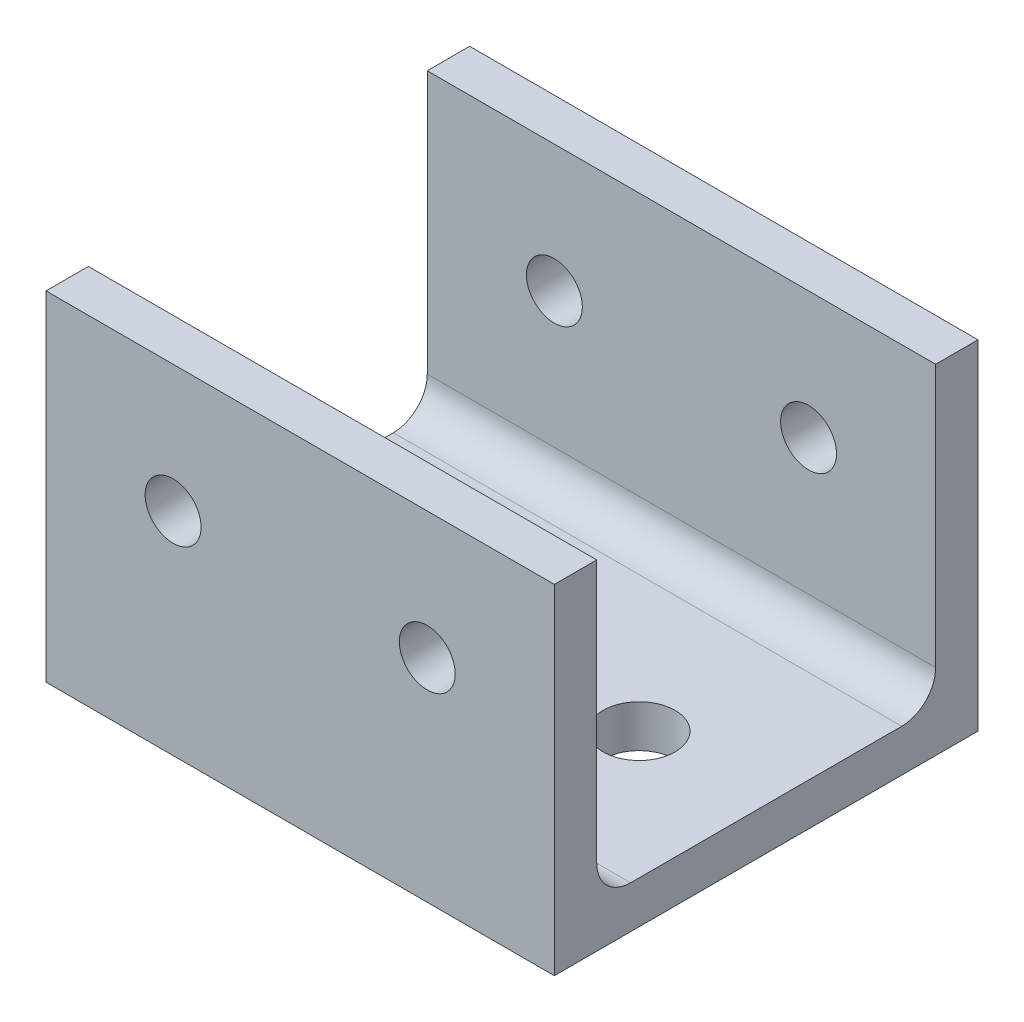
ISO-10303-21;
HEADER;
FILE_DESCRIPTION(('STEP AP214'),'2;1');
FILE_NAME('part.step','',(''),(''),'','','');
FILE_SCHEMA(('AUTOMOTIVE_DESIGN { 1 0 10303 214 1 1 1 1 }'));
ENDSEC;
DATA;
#1=APPLICATION_CONTEXT('core data for automotive mechanical design processes');
#2=APPLICATION_PROTOCOL_DEFINITION('international standard','automotive_design',2000,#1);
#3=PRODUCT_CONTEXT('',#1,'mechanical');
#4=PRODUCT('Part','Part','',(#3));
#5=PRODUCT_RELATED_PRODUCT_CATEGORY('part','',(#4));
#6=PRODUCT_DEFINITION_FORMATION('','',#4);
#7=PRODUCT_DEFINITION_CONTEXT('part definition',#1,'design');
#8=PRODUCT_DEFINITION('design','',#6,#7);
#9=PRODUCT_DEFINITION_SHAPE('','',#8);
#10=(LENGTH_UNIT() NAMED_UNIT(*) SI_UNIT(.MILLI.,.METRE.));
#11=(NAMED_UNIT(*) PLANE_ANGLE_UNIT() SI_UNIT($,.RADIAN.));
#12=(NAMED_UNIT(*) SI_UNIT($,.STERADIAN.) SOLID_ANGLE_UNIT());
#13=UNCERTAINTY_MEASURE_WITH_UNIT(LENGTH_MEASURE(1.E-05),#10,'distance_accuracy_value','');
#14=(GEOMETRIC_REPRESENTATION_CONTEXT(3) GLOBAL_UNCERTAINTY_ASSIGNED_CONTEXT((#13)) GLOBAL_UNIT_ASSIGNED_CONTEXT((#10,
#11,#12)) REPRESENTATION_CONTEXT('',''));
#15=CARTESIAN_POINT('',(0.,0.,0.));
#16=DIRECTION('',(0.,0.,1.));
#17=DIRECTION('',(1.,0.,0.));
#18=AXIS2_PLACEMENT_3D('',#15,#16,#17);
#19=CARTESIAN_POINT('',(60.,40.,0.));
#20=DIRECTION('',(0.,0.,-1.));
#21=DIRECTION('',(-1.,0.,0.));
#22=AXIS2_PLACEMENT_3D('',#19,#20,#21);
#23=PLANE('',#22);
#24=CARTESIAN_POINT('',(15.,25.,0.));
#25=DIRECTION('',(0.,0.,1.));
#26=DIRECTION('',(1.,0.,0.));
#27=AXIS2_PLACEMENT_3D('',#24,#25,#26);
#28=CIRCLE('',#27,3.3);
#29=CARTESIAN_POINT('',(18.3,25.,0.));
#30=VERTEX_POINT('',#29);
#31=EDGE_CURVE('E246',#30,#30,#28,.T.);
#32=ORIENTED_EDGE('',*,*,#31,.F.);
#33=EDGE_LOOP('',(#32));
#34=FACE_BOUND('',#33,.T.);
#35=CARTESIAN_POINT('',(45.,25.,0.));
#36=DIRECTION('',(0.,0.,1.));
#37=DIRECTION('',(1.,0.,0.));
#38=AXIS2_PLACEMENT_3D('',#35,#36,#37);
#39=CIRCLE('',#38,3.3);
#40=CARTESIAN_POINT('',(48.3,25.,0.));
#41=VERTEX_POINT('',#40);
#42=EDGE_CURVE('E240',#41,#41,#39,.T.);
#43=ORIENTED_EDGE('',*,*,#42,.F.);
#44=EDGE_LOOP('',(#43));
#45=FACE_BOUND('',#44,.T.);
#46=DIRECTION('',(0.,-1.,0.));
#47=VECTOR('',#46,1.);
#48=CARTESIAN_POINT('',(0.,40.,0.));
#49=LINE('',#48,#47);
#50=CARTESIAN_POINT('',(0.,40.,0.));
#51=VERTEX_POINT('',#50);
#52=CARTESIAN_POINT('',(0.,0.,0.));
#53=VERTEX_POINT('',#52);
#54=EDGE_CURVE('E137',#51,#53,#49,.T.);
#55=ORIENTED_EDGE('',*,*,#54,.T.);
#56=DIRECTION('',(-1.,0.,0.));
#57=VECTOR('',#56,1.);
#58=CARTESIAN_POINT('',(60.,0.,0.));
#59=LINE('',#58,#57);
#60=CARTESIAN_POINT('',(60.,0.,0.));
#61=VERTEX_POINT('',#60);
#62=EDGE_CURVE('E118',#61,#53,#59,.T.);
#63=ORIENTED_EDGE('',*,*,#62,.F.);
#64=DIRECTION('',(0.,-1.,0.));
#65=VECTOR('',#64,1.);
#66=CARTESIAN_POINT('',(60.,40.,0.));
#67=LINE('',#66,#65);
#68=CARTESIAN_POINT('',(60.,40.,0.));
#69=VERTEX_POINT('',#68);
#70=EDGE_CURVE('E125',#69,#61,#67,.T.);
#71=ORIENTED_EDGE('',*,*,#70,.F.);
#72=DIRECTION('',(-1.,0.,0.));
#73=VECTOR('',#72,1.);
#74=CARTESIAN_POINT('',(60.,40.,0.));
#75=LINE('',#74,#73);
#76=EDGE_CURVE('E204',#69,#51,#75,.T.);
#77=ORIENTED_EDGE('',*,*,#76,.T.);
#78=EDGE_LOOP('',(#55,#63,#71,#77));
#79=FACE_BOUND('',#78,.T.);
#80=ADVANCED_FACE('F37',(#34,#45,#79),#23,.F.);
#81=CARTESIAN_POINT('',(60.,0.,0.));
#82=DIRECTION('',(0.,1.,0.));
#83=DIRECTION('',(0.,0.,1.));
#84=AXIS2_PLACEMENT_3D('',#81,#82,#83);
#85=PLANE('',#84);
#86=CARTESIAN_POINT('',(15.,0.,-25.));
#87=DIRECTION('',(0.,1.,0.));
#88=DIRECTION('',(0.,0.,1.));
#89=AXIS2_PLACEMENT_3D('',#86,#87,#88);
#90=CIRCLE('',#89,4.25);
#91=CARTESIAN_POINT('',(15.,0.,-20.75));
#92=VERTEX_POINT('',#91);
#93=EDGE_CURVE('E151',#92,#92,#90,.T.);
#94=ORIENTED_EDGE('',*,*,#93,.T.);
#95=EDGE_LOOP('',(#94));
#96=FACE_BOUND('',#95,.T.);
#97=CARTESIAN_POINT('',(45.,0.,-25.));
#98=DIRECTION('',(0.,1.,0.));
#99=DIRECTION('',(0.,0.,1.));
#100=AXIS2_PLACEMENT_3D('',#97,#98,#99);
#101=CIRCLE('',#100,4.25);
#102=CARTESIAN_POINT('',(45.,0.,-20.75));
#103=VERTEX_POINT('',#102);
#104=EDGE_CURVE('E231',#103,#103,#101,.T.);
#105=ORIENTED_EDGE('',*,*,#104,.T.);
#106=EDGE_LOOP('',(#105));
#107=FACE_BOUND('',#106,.T.);
#108=DIRECTION('',(0.,0.,-1.));
#109=VECTOR('',#108,1.);
#110=CARTESIAN_POINT('',(0.,0.,0.));
#111=LINE('',#110,#109);
#112=CARTESIAN_POINT('',(0.,0.,-50.));
#113=VERTEX_POINT('',#112);
#114=EDGE_CURVE('E220',#53,#113,#111,.T.);
#115=ORIENTED_EDGE('',*,*,#114,.T.);
#116=DIRECTION('',(-1.,0.,0.));
#117=VECTOR('',#116,1.);
#118=CARTESIAN_POINT('',(60.,0.,-50.));
#119=LINE('',#118,#117);
#120=CARTESIAN_POINT('',(60.,0.,-50.));
#121=VERTEX_POINT('',#120);
#122=EDGE_CURVE('E121',#121,#113,#119,.T.);
#123=ORIENTED_EDGE('',*,*,#122,.F.);
#124=DIRECTION('',(0.,0.,-1.));
#125=VECTOR('',#124,1.);
#126=CARTESIAN_POINT('',(60.,0.,0.));
#127=LINE('',#126,#125);
#128=EDGE_CURVE('E114',#61,#121,#127,.T.);
#129=ORIENTED_EDGE('',*,*,#128,.F.);
#130=ORIENTED_EDGE('',*,*,#62,.T.);
#131=EDGE_LOOP('',(#115,#123,#129,#130));
#132=FACE_BOUND('',#131,.T.);
#133=ADVANCED_FACE('F116',(#96,#107,#132),#85,.F.);
#134=CARTESIAN_POINT('',(60.,0.,-50.));
#135=DIRECTION('',(0.,0.,1.));
#136=DIRECTION('',(1.,0.,0.));
#137=AXIS2_PLACEMENT_3D('',#134,#135,#136);
#138=PLANE('',#137);
#139=CARTESIAN_POINT('',(15.,25.,-50.));
#140=DIRECTION('',(0.,0.,1.));
#141=DIRECTION('',(1.,0.,0.));
#142=AXIS2_PLACEMENT_3D('',#139,#140,#141);
#143=CIRCLE('',#142,3.3);
#144=CARTESIAN_POINT('',(18.3,25.,-50.));
#145=VERTEX_POINT('',#144);
#146=EDGE_CURVE('E158',#145,#145,#143,.T.);
#147=ORIENTED_EDGE('',*,*,#146,.T.);
#148=EDGE_LOOP('',(#147));
#149=FACE_BOUND('',#148,.T.);
#150=CARTESIAN_POINT('',(45.,25.,-50.));
#151=DIRECTION('',(0.,0.,1.));
#152=DIRECTION('',(1.,0.,0.));
#153=AXIS2_PLACEMENT_3D('',#150,#151,#152);
#154=CIRCLE('',#153,3.3);
#155=CARTESIAN_POINT('',(48.3,25.,-50.));
#156=VERTEX_POINT('',#155);
#157=EDGE_CURVE('E243',#156,#156,#154,.T.);
#158=ORIENTED_EDGE('',*,*,#157,.T.);
#159=EDGE_LOOP('',(#158));
#160=FACE_BOUND('',#159,.T.);
#161=DIRECTION('',(0.,1.,0.));
#162=VECTOR('',#161,1.);
#163=CARTESIAN_POINT('',(0.,0.,-50.));
#164=LINE('',#163,#162);
#165=CARTESIAN_POINT('',(0.,40.,-50.));
#166=VERTEX_POINT('',#165);
#167=EDGE_CURVE('E219',#113,#166,#164,.T.);
#168=ORIENTED_EDGE('',*,*,#167,.T.);
#169=DIRECTION('',(-1.,0.,0.));
#170=VECTOR('',#169,1.);
#171=CARTESIAN_POINT('',(60.,40.,-50.));
#172=LINE('',#171,#170);
#173=CARTESIAN_POINT('',(60.,40.,-50.));
#174=VERTEX_POINT('',#173);
#175=EDGE_CURVE('E143',#174,#166,#172,.T.);
#176=ORIENTED_EDGE('',*,*,#175,.F.);
#177=DIRECTION('',(0.,1.,0.));
#178=VECTOR('',#177,1.);
#179=CARTESIAN_POINT('',(60.,0.,-50.));
#180=LINE('',#179,#178);
#181=EDGE_CURVE('E124',#121,#174,#180,.T.);
#182=ORIENTED_EDGE('',*,*,#181,.F.);
#183=ORIENTED_EDGE('',*,*,#122,.T.);
#184=EDGE_LOOP('',(#168,#176,#182,#183));
#185=FACE_BOUND('',#184,.T.);
#186=ADVANCED_FACE('F252',(#149,#160,#185),#138,.F.);
#187=CARTESIAN_POINT('',(60.,40.,-50.));
#188=DIRECTION('',(0.,-1.,0.));
#189=DIRECTION('',(0.,0.,-1.));
#190=AXIS2_PLACEMENT_3D('',#187,#188,#189);
#191=PLANE('',#190);
#192=DIRECTION('',(0.,0.,1.));
#193=VECTOR('',#192,1.);
#194=CARTESIAN_POINT('',(0.,40.,-50.));
#195=LINE('',#194,#193);
#196=CARTESIAN_POINT('',(0.,40.,-45.));
#197=VERTEX_POINT('',#196);
#198=EDGE_CURVE('E199',#166,#197,#195,.T.);
#199=ORIENTED_EDGE('',*,*,#198,.T.);
#200=DIRECTION('',(-1.,0.,0.));
#201=VECTOR('',#200,1.);
#202=CARTESIAN_POINT('',(60.,40.,-45.));
#203=LINE('',#202,#201);
#204=CARTESIAN_POINT('',(60.,40.,-45.));
#205=VERTEX_POINT('',#204);
#206=EDGE_CURVE('E207',#205,#197,#203,.T.);
#207=ORIENTED_EDGE('',*,*,#206,.F.);
#208=DIRECTION('',(0.,0.,1.));
#209=VECTOR('',#208,1.);
#210=CARTESIAN_POINT('',(60.,40.,-50.));
#211=LINE('',#210,#209);
#212=EDGE_CURVE('E216',#174,#205,#211,.T.);
#213=ORIENTED_EDGE('',*,*,#212,.F.);
#214=ORIENTED_EDGE('',*,*,#175,.T.);
#215=EDGE_LOOP('',(#199,#207,#213,#214));
#216=FACE_BOUND('',#215,.T.);
#217=ADVANCED_FACE('F214',(#216),#191,.F.);
#218=CARTESIAN_POINT('',(60.,40.,-45.));
#219=DIRECTION('',(0.,0.,-1.));
#220=DIRECTION('',(-1.,0.,0.));
#221=AXIS2_PLACEMENT_3D('',#218,#219,#220);
#222=PLANE('',#221);
#223=CARTESIAN_POINT('',(15.,25.,-45.));
#224=DIRECTION('',(0.,0.,-1.));
#225=DIRECTION('',(-1.,0.,0.));
#226=AXIS2_PLACEMENT_3D('',#223,#224,#225);
#227=CIRCLE('',#226,3.3);
#228=CARTESIAN_POINT('',(11.7,25.,-45.));
#229=VERTEX_POINT('',#228);
#230=EDGE_CURVE('E161',#229,#229,#227,.T.);
#231=ORIENTED_EDGE('',*,*,#230,.T.);
#232=EDGE_LOOP('',(#231));
#233=FACE_BOUND('',#232,.T.);
#234=CARTESIAN_POINT('',(45.,25.,-45.));
#235=DIRECTION('',(0.,0.,-1.));
#236=DIRECTION('',(-1.,0.,0.));
#237=AXIS2_PLACEMENT_3D('',#234,#235,#236);
#238=CIRCLE('',#237,3.3);
#239=CARTESIAN_POINT('',(41.7,25.,-45.));
#240=VERTEX_POINT('',#239);
#241=EDGE_CURVE('E157',#240,#240,#238,.T.);
#242=ORIENTED_EDGE('',*,*,#241,.T.);
#243=EDGE_LOOP('',(#242));
#244=FACE_BOUND('',#243,.T.);
#245=DIRECTION('',(0.,-1.,0.));
#246=VECTOR('',#245,1.);
#247=CARTESIAN_POINT('',(0.,40.,-45.));
#248=LINE('',#247,#246);
#249=CARTESIAN_POINT('',(0.,9.,-45.));
#250=VERTEX_POINT('',#249);
#251=EDGE_CURVE('E196',#197,#250,#248,.T.);
#252=ORIENTED_EDGE('',*,*,#251,.T.);
#253=DIRECTION('',(-1.,0.,0.));
#254=VECTOR('',#253,1.);
#255=CARTESIAN_POINT('',(60.,9.,-45.));
#256=LINE('',#255,#254);
#257=CARTESIAN_POINT('',(60.,9.,-45.));
#258=VERTEX_POINT('',#257);
#259=EDGE_CURVE('E52',#250,#258,#256,.F.);
#260=ORIENTED_EDGE('',*,*,#259,.T.);
#261=DIRECTION('',(0.,-1.,0.));
#262=VECTOR('',#261,1.);
#263=CARTESIAN_POINT('',(60.,40.,-45.));
#264=LINE('',#263,#262);
#265=EDGE_CURVE('E227',#205,#258,#264,.T.);
#266=ORIENTED_EDGE('',*,*,#265,.F.);
#267=ORIENTED_EDGE('',*,*,#206,.T.);
#268=EDGE_LOOP('',(#252,#260,#266,#267));
#269=FACE_BOUND('',#268,.T.);
#270=ADVANCED_FACE('F263',(#233,#244,#269),#222,.F.);
#271=CARTESIAN_POINT('',(60.,5.,-45.));
#272=DIRECTION('',(0.,-1.,0.));
#273=DIRECTION('',(0.,0.,-1.));
#274=AXIS2_PLACEMENT_3D('',#271,#272,#273);
#275=PLANE('',#274);
#276=CARTESIAN_POINT('',(15.,5.,-25.));
#277=DIRECTION('',(0.,-1.,0.));
#278=DIRECTION('',(0.,0.,-1.));
#279=AXIS2_PLACEMENT_3D('',#276,#277,#278);
#280=CIRCLE('',#279,4.25);
#281=CARTESIAN_POINT('',(15.,5.,-29.25));
#282=VERTEX_POINT('',#281);
#283=EDGE_CURVE('E150',#282,#282,#280,.F.);
#284=ORIENTED_EDGE('',*,*,#283,.F.);
#285=EDGE_LOOP('',(#284));
#286=FACE_BOUND('',#285,.T.);
#287=CARTESIAN_POINT('',(45.,5.,-25.));
#288=DIRECTION('',(0.,-1.,0.));
#289=DIRECTION('',(0.,0.,-1.));
#290=AXIS2_PLACEMENT_3D('',#287,#288,#289);
#291=CIRCLE('',#290,4.25);
#292=CARTESIAN_POINT('',(45.,5.,-29.25));
#293=VERTEX_POINT('',#292);
#294=EDGE_CURVE('E147',#293,#293,#291,.F.);
#295=ORIENTED_EDGE('',*,*,#294,.F.);
#296=EDGE_LOOP('',(#295));
#297=FACE_BOUND('',#296,.T.);
#298=DIRECTION('',(0.,0.,1.));
#299=VECTOR('',#298,1.);
#300=CARTESIAN_POINT('',(0.,5.,-45.));
#301=LINE('',#300,#299);
#302=CARTESIAN_POINT('',(0.,5.,-41.));
#303=VERTEX_POINT('',#302);
#304=CARTESIAN_POINT('',(0.,5.,-9.));
#305=VERTEX_POINT('',#304);
#306=EDGE_CURVE('E190',#303,#305,#301,.T.);
#307=ORIENTED_EDGE('',*,*,#306,.T.);
#308=DIRECTION('',(-1.,0.,0.));
#309=VECTOR('',#308,1.);
#310=CARTESIAN_POINT('',(60.,5.,-9.));
#311=LINE('',#310,#309);
#312=CARTESIAN_POINT('',(60.,5.,-9.));
#313=VERTEX_POINT('',#312);
#314=EDGE_CURVE('E165',#305,#313,#311,.F.);
#315=ORIENTED_EDGE('',*,*,#314,.T.);
#316=DIRECTION('',(0.,0.,1.));
#317=VECTOR('',#316,1.);
#318=CARTESIAN_POINT('',(60.,5.,-45.));
#319=LINE('',#318,#317);
#320=CARTESIAN_POINT('',(60.,5.,-41.));
#321=VERTEX_POINT('',#320);
#322=EDGE_CURVE('E177',#321,#313,#319,.T.);
#323=ORIENTED_EDGE('',*,*,#322,.F.);
#324=DIRECTION('',(-1.,0.,0.));
#325=VECTOR('',#324,1.);
#326=CARTESIAN_POINT('',(0.,5.,-41.));
#327=LINE('',#326,#325);
#328=EDGE_CURVE('E141',#321,#303,#327,.T.);
#329=ORIENTED_EDGE('',*,*,#328,.T.);
#330=EDGE_LOOP('',(#307,#315,#323,#329));
#331=FACE_BOUND('',#330,.T.);
#332=ADVANCED_FACE('F194',(#286,#297,#331),#275,.F.);
#333=CARTESIAN_POINT('',(60.,5.,-5.));
#334=DIRECTION('',(0.,0.,1.));
#335=DIRECTION('',(1.,0.,0.));
#336=AXIS2_PLACEMENT_3D('',#333,#334,#335);
#337=PLANE('',#336);
#338=CARTESIAN_POINT('',(15.,25.,-5.));
#339=DIRECTION('',(0.,0.,1.));
#340=DIRECTION('',(1.,0.,0.));
#341=AXIS2_PLACEMENT_3D('',#338,#339,#340);
#342=CIRCLE('',#341,3.3);
#343=CARTESIAN_POINT('',(18.3,25.,-5.));
#344=VERTEX_POINT('',#343);
#345=EDGE_CURVE('E159',#344,#344,#342,.T.);
#346=ORIENTED_EDGE('',*,*,#345,.T.);
#347=EDGE_LOOP('',(#346));
#348=FACE_BOUND('',#347,.T.);
#349=CARTESIAN_POINT('',(45.,25.,-5.));
#350=DIRECTION('',(0.,0.,1.));
#351=DIRECTION('',(1.,0.,0.));
#352=AXIS2_PLACEMENT_3D('',#349,#350,#351);
#353=CIRCLE('',#352,3.3);
#354=CARTESIAN_POINT('',(48.3,25.,-5.));
#355=VERTEX_POINT('',#354);
#356=EDGE_CURVE('E154',#355,#355,#353,.T.);
#357=ORIENTED_EDGE('',*,*,#356,.T.);
#358=EDGE_LOOP('',(#357));
#359=FACE_BOUND('',#358,.T.);
#360=DIRECTION('',(0.,1.,0.));
#361=VECTOR('',#360,1.);
#362=CARTESIAN_POINT('',(60.,5.,-5.));
#363=LINE('',#362,#361);
#364=CARTESIAN_POINT('',(60.,9.,-5.));
#365=VERTEX_POINT('',#364);
#366=CARTESIAN_POINT('',(60.,40.,-5.));
#367=VERTEX_POINT('',#366);
#368=EDGE_CURVE('E174',#365,#367,#363,.T.);
#369=ORIENTED_EDGE('',*,*,#368,.F.);
#370=DIRECTION('',(-1.,0.,0.));
#371=VECTOR('',#370,1.);
#372=CARTESIAN_POINT('',(0.,9.,-5.));
#373=LINE('',#372,#371);
#374=CARTESIAN_POINT('',(0.,9.,-5.));
#375=VERTEX_POINT('',#374);
#376=EDGE_CURVE('E138',#365,#375,#373,.T.);
#377=ORIENTED_EDGE('',*,*,#376,.T.);
#378=DIRECTION('',(0.,1.,0.));
#379=VECTOR('',#378,1.);
#380=CARTESIAN_POINT('',(0.,5.,-5.));
#381=LINE('',#380,#379);
#382=CARTESIAN_POINT('',(0.,40.,-5.));
#383=VERTEX_POINT('',#382);
#384=EDGE_CURVE('E192',#375,#383,#381,.T.);
#385=ORIENTED_EDGE('',*,*,#384,.T.);
#386=DIRECTION('',(-1.,0.,0.));
#387=VECTOR('',#386,1.);
#388=CARTESIAN_POINT('',(60.,40.,-5.));
#389=LINE('',#388,#387);
#390=EDGE_CURVE('E185',#367,#383,#389,.T.);
#391=ORIENTED_EDGE('',*,*,#390,.F.);
#392=EDGE_LOOP('',(#369,#377,#385,#391));
#393=FACE_BOUND('',#392,.T.);
#394=ADVANCED_FACE('F182',(#348,#359,#393),#337,.F.);
#395=CARTESIAN_POINT('',(60.,40.,-5.));
#396=DIRECTION('',(0.,-1.,0.));
#397=DIRECTION('',(0.,0.,-1.));
#398=AXIS2_PLACEMENT_3D('',#395,#396,#397);
#399=PLANE('',#398);
#400=DIRECTION('',(0.,0.,1.));
#401=VECTOR('',#400,1.);
#402=CARTESIAN_POINT('',(0.,40.,-5.));
#403=LINE('',#402,#401);
#404=EDGE_CURVE('E134',#383,#51,#403,.T.);
#405=ORIENTED_EDGE('',*,*,#404,.T.);
#406=ORIENTED_EDGE('',*,*,#76,.F.);
#407=DIRECTION('',(0.,0.,1.));
#408=VECTOR('',#407,1.);
#409=CARTESIAN_POINT('',(60.,40.,-5.));
#410=LINE('',#409,#408);
#411=EDGE_CURVE('E130',#367,#69,#410,.T.);
#412=ORIENTED_EDGE('',*,*,#411,.F.);
#413=ORIENTED_EDGE('',*,*,#390,.T.);
#414=EDGE_LOOP('',(#405,#406,#412,#413));
#415=FACE_BOUND('',#414,.T.);
#416=ADVANCED_FACE('F317',(#415),#399,.F.);
#417=CARTESIAN_POINT('',(60.,0.,0.));
#418=DIRECTION('',(1.,0.,0.));
#419=DIRECTION('',(0.,0.,-1.));
#420=AXIS2_PLACEMENT_3D('',#417,#418,#419);
#421=PLANE('',#420);
#422=ORIENTED_EDGE('',*,*,#70,.T.);
#423=ORIENTED_EDGE('',*,*,#128,.T.);
#424=ORIENTED_EDGE('',*,*,#181,.T.);
#425=ORIENTED_EDGE('',*,*,#212,.T.);
#426=ORIENTED_EDGE('',*,*,#265,.T.);
#427=CARTESIAN_POINT('',(60.,9.,-41.));
#428=DIRECTION('',(1.,0.,0.));
#429=DIRECTION('',(0.,0.,-1.));
#430=AXIS2_PLACEMENT_3D('',#427,#428,#429);
#431=CIRCLE('',#430,4.);
#432=EDGE_CURVE('E11',#258,#321,#431,.F.);
#433=ORIENTED_EDGE('',*,*,#432,.T.);
#434=ORIENTED_EDGE('',*,*,#322,.T.);
#435=CARTESIAN_POINT('',(60.,9.,-9.));
#436=DIRECTION('',(1.,0.,0.));
#437=DIRECTION('',(0.,0.,-1.));
#438=AXIS2_PLACEMENT_3D('',#435,#436,#437);
#439=CIRCLE('',#438,4.);
#440=EDGE_CURVE('E170',#313,#365,#439,.F.);
#441=ORIENTED_EDGE('',*,*,#440,.T.);
#442=ORIENTED_EDGE('',*,*,#368,.T.);
#443=ORIENTED_EDGE('',*,*,#411,.T.);
#444=EDGE_LOOP('',(#422,#423,#424,#425,#426,#433,#434,#441,#442,#443));
#445=FACE_BOUND('',#444,.T.);
#446=ADVANCED_FACE('F128',(#445),#421,.T.);
#447=CARTESIAN_POINT('',(0.,0.,0.));
#448=DIRECTION('',(1.,0.,0.));
#449=DIRECTION('',(0.,0.,-1.));
#450=AXIS2_PLACEMENT_3D('',#447,#448,#449);
#451=PLANE('',#450);
#452=ORIENTED_EDGE('',*,*,#54,.F.);
#453=ORIENTED_EDGE('',*,*,#404,.F.);
#454=ORIENTED_EDGE('',*,*,#384,.F.);
#455=CARTESIAN_POINT('',(0.,9.,-9.));
#456=DIRECTION('',(1.,0.,0.));
#457=DIRECTION('',(0.,0.,-1.));
#458=AXIS2_PLACEMENT_3D('',#455,#456,#457);
#459=CIRCLE('',#458,4.);
#460=EDGE_CURVE('E168',#375,#305,#459,.T.);
#461=ORIENTED_EDGE('',*,*,#460,.T.);
#462=ORIENTED_EDGE('',*,*,#306,.F.);
#463=CARTESIAN_POINT('',(0.,9.,-41.));
#464=DIRECTION('',(1.,0.,0.));
#465=DIRECTION('',(0.,0.,-1.));
#466=AXIS2_PLACEMENT_3D('',#463,#464,#465);
#467=CIRCLE('',#466,4.);
#468=EDGE_CURVE('E45',#303,#250,#467,.T.);
#469=ORIENTED_EDGE('',*,*,#468,.T.);
#470=ORIENTED_EDGE('',*,*,#251,.F.);
#471=ORIENTED_EDGE('',*,*,#198,.F.);
#472=ORIENTED_EDGE('',*,*,#167,.F.);
#473=ORIENTED_EDGE('',*,*,#114,.F.);
#474=EDGE_LOOP('',(#452,#453,#454,#461,#462,#469,#470,#471,#472,#473));
#475=FACE_BOUND('',#474,.T.);
#476=ADVANCED_FACE('F189',(#475),#451,.F.);
#477=CARTESIAN_POINT('',(45.,40.,-25.));
#478=DIRECTION('',(0.,-1.,0.));
#479=DIRECTION('',(0.,0.,-1.));
#480=AXIS2_PLACEMENT_3D('',#477,#478,#479);
#481=CYLINDRICAL_SURFACE('',#480,4.25);
#482=ORIENTED_EDGE('',*,*,#104,.F.);
#483=EDGE_LOOP('',(#482));
#484=FACE_BOUND('',#483,.T.);
#485=ORIENTED_EDGE('',*,*,#294,.T.);
#486=EDGE_LOOP('',(#485));
#487=FACE_BOUND('',#486,.T.);
#488=ADVANCED_FACE('F306',(#484,#487),#481,.F.);
#489=CARTESIAN_POINT('',(15.,40.,-25.));
#490=DIRECTION('',(0.,-1.,0.));
#491=DIRECTION('',(0.,0.,-1.));
#492=AXIS2_PLACEMENT_3D('',#489,#490,#491);
#493=CYLINDRICAL_SURFACE('',#492,4.25);
#494=ORIENTED_EDGE('',*,*,#93,.F.);
#495=EDGE_LOOP('',(#494));
#496=FACE_BOUND('',#495,.T.);
#497=ORIENTED_EDGE('',*,*,#283,.T.);
#498=EDGE_LOOP('',(#497));
#499=FACE_BOUND('',#498,.T.);
#500=ADVANCED_FACE('F375',(#496,#499),#493,.F.);
#501=CARTESIAN_POINT('',(45.,25.,-50.));
#502=DIRECTION('',(0.,0.,1.));
#503=DIRECTION('',(1.,0.,0.));
#504=AXIS2_PLACEMENT_3D('',#501,#502,#503);
#505=CYLINDRICAL_SURFACE('',#504,3.3);
#506=ORIENTED_EDGE('',*,*,#42,.T.);
#507=EDGE_LOOP('',(#506));
#508=FACE_BOUND('',#507,.T.);
#509=ORIENTED_EDGE('',*,*,#356,.F.);
#510=EDGE_LOOP('',(#509));
#511=FACE_BOUND('',#510,.T.);
#512=ADVANCED_FACE('F360',(#508,#511),#505,.F.);
#513=CARTESIAN_POINT('',(15.,25.,-50.));
#514=DIRECTION('',(0.,0.,1.));
#515=DIRECTION('',(1.,0.,0.));
#516=AXIS2_PLACEMENT_3D('',#513,#514,#515);
#517=CYLINDRICAL_SURFACE('',#516,3.3);
#518=ORIENTED_EDGE('',*,*,#31,.T.);
#519=EDGE_LOOP('',(#518));
#520=FACE_BOUND('',#519,.T.);
#521=ORIENTED_EDGE('',*,*,#345,.F.);
#522=EDGE_LOOP('',(#521));
#523=FACE_BOUND('',#522,.T.);
#524=ADVANCED_FACE('F260',(#520,#523),#517,.F.);
#525=ORIENTED_EDGE('',*,*,#157,.F.);
#526=EDGE_LOOP('',(#525));
#527=FACE_BOUND('',#526,.T.);
#528=ORIENTED_EDGE('',*,*,#241,.F.);
#529=EDGE_LOOP('',(#528));
#530=FACE_BOUND('',#529,.T.);
#531=ADVANCED_FACE('F258',(#527,#530),#505,.F.);
#532=ORIENTED_EDGE('',*,*,#146,.F.);
#533=EDGE_LOOP('',(#532));
#534=FACE_BOUND('',#533,.T.);
#535=ORIENTED_EDGE('',*,*,#230,.F.);
#536=EDGE_LOOP('',(#535));
#537=FACE_BOUND('',#536,.T.);
#538=ADVANCED_FACE('F255',(#534,#537),#517,.F.);
#539=CARTESIAN_POINT('',(60.,9.,-9.));
#540=DIRECTION('',(1.,0.,0.));
#541=DIRECTION('',(0.,0.,-1.));
#542=AXIS2_PLACEMENT_3D('',#539,#540,#541);
#543=CYLINDRICAL_SURFACE('',#542,4.);
#544=ORIENTED_EDGE('',*,*,#440,.F.);
#545=ORIENTED_EDGE('',*,*,#314,.F.);
#546=ORIENTED_EDGE('',*,*,#460,.F.);
#547=ORIENTED_EDGE('',*,*,#376,.F.);
#548=EDGE_LOOP('',(#544,#545,#546,#547));
#549=FACE_BOUND('',#548,.T.);
#550=ADVANCED_FACE('F187',(#549),#543,.F.);
#551=CARTESIAN_POINT('',(60.,9.,-41.));
#552=DIRECTION('',(1.,0.,0.));
#553=DIRECTION('',(0.,0.,-1.));
#554=AXIS2_PLACEMENT_3D('',#551,#552,#553);
#555=CYLINDRICAL_SURFACE('',#554,4.);
#556=ORIENTED_EDGE('',*,*,#432,.F.);
#557=ORIENTED_EDGE('',*,*,#259,.F.);
#558=ORIENTED_EDGE('',*,*,#468,.F.);
#559=ORIENTED_EDGE('',*,*,#328,.F.);
#560=EDGE_LOOP('',(#556,#557,#558,#559));
#561=FACE_BOUND('',#560,.T.);
#562=ADVANCED_FACE('F39',(#561),#555,.F.);
#563=CLOSED_SHELL('',(#80,#133,#186,#217,#270,#332,#394,#416,#446,#476,#488,#500,#512,#524,#531,
#538,#550,#562));
#564=MANIFOLD_SOLID_BREP('B2',#563);
#565=ADVANCED_BREP_SHAPE_REPRESENTATION('',(#18,#564),#14);
#566=SHAPE_DEFINITION_REPRESENTATION(#9,#565);
ENDSEC;
END-ISO-10303-21;
